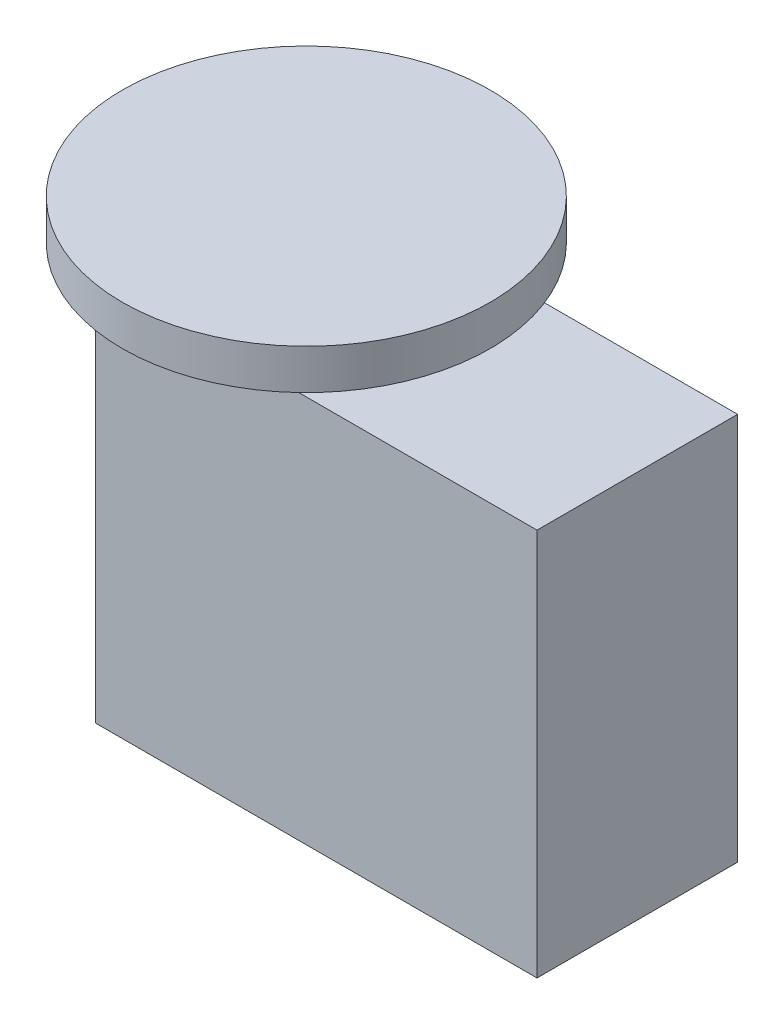
ISO-10303-21;
HEADER;
FILE_DESCRIPTION(('STEP AP214'),'2;1');
FILE_NAME('part.step','',(''),(''),'','','');
FILE_SCHEMA(('AUTOMOTIVE_DESIGN { 1 0 10303 214 1 1 1 1 }'));
ENDSEC;
DATA;
#1=APPLICATION_CONTEXT('core data for automotive mechanical design processes');
#2=APPLICATION_PROTOCOL_DEFINITION('international standard','automotive_design',2000,#1);
#3=PRODUCT_CONTEXT('',#1,'mechanical');
#4=PRODUCT('Part','Part','',(#3));
#5=PRODUCT_RELATED_PRODUCT_CATEGORY('part','',(#4));
#6=PRODUCT_DEFINITION_FORMATION('','',#4);
#7=PRODUCT_DEFINITION_CONTEXT('part definition',#1,'design');
#8=PRODUCT_DEFINITION('design','',#6,#7);
#9=PRODUCT_DEFINITION_SHAPE('','',#8);
#10=(LENGTH_UNIT() NAMED_UNIT(*) SI_UNIT(.MILLI.,.METRE.));
#11=(NAMED_UNIT(*) PLANE_ANGLE_UNIT() SI_UNIT($,.RADIAN.));
#12=(NAMED_UNIT(*) SI_UNIT($,.STERADIAN.) SOLID_ANGLE_UNIT());
#13=UNCERTAINTY_MEASURE_WITH_UNIT(LENGTH_MEASURE(1.E-05),#10,'distance_accuracy_value','');
#14=(GEOMETRIC_REPRESENTATION_CONTEXT(3) GLOBAL_UNCERTAINTY_ASSIGNED_CONTEXT((#13)) GLOBAL_UNIT_ASSIGNED_CONTEXT((#10,
#11,#12)) REPRESENTATION_CONTEXT('',''));
#15=CARTESIAN_POINT('',(0.,0.,0.));
#16=DIRECTION('',(0.,0.,1.));
#17=DIRECTION('',(1.,0.,0.));
#18=AXIS2_PLACEMENT_3D('',#15,#16,#17);
#19=CARTESIAN_POINT('',(0.,-3.,0.));
#20=DIRECTION('',(0.,1.,0.));
#21=DIRECTION('',(0.,0.,1.));
#22=AXIS2_PLACEMENT_3D('',#19,#20,#21);
#23=PLANE('',#22);
#24=CARTESIAN_POINT('',(-66.5681235261815,-3.,29.8609458280841));
#25=DIRECTION('',(0.,1.,0.));
#26=DIRECTION('',(0.,0.,1.));
#27=AXIS2_PLACEMENT_3D('',#24,#25,#26);
#28=CIRCLE('',#27,0.999999999999998);
#29=CARTESIAN_POINT('',(-66.5681235261815,-3.,30.8609458280841));
#30=VERTEX_POINT('',#29);
#31=EDGE_CURVE('E40',#30,#30,#28,.F.);
#32=ORIENTED_EDGE('',*,*,#31,.F.);
#33=EDGE_LOOP('',(#32));
#34=FACE_BOUND('',#33,.T.);
#35=DIRECTION('',(0.,0.,-1.));
#36=VECTOR('',#35,1.);
#37=CARTESIAN_POINT('',(-69.5681235261815,-3.,24.8609458280841));
#38=LINE('',#37,#36);
#39=CARTESIAN_POINT('',(-69.5681235261815,-3.,44.8609458280841));
#40=VERTEX_POINT('',#39);
#41=CARTESIAN_POINT('',(-69.5681235261815,-3.,24.8609458280841));
#42=VERTEX_POINT('',#41);
#43=EDGE_CURVE('E105',#40,#42,#38,.T.);
#44=ORIENTED_EDGE('',*,*,#43,.T.);
#45=DIRECTION('',(1.,0.,0.));
#46=VECTOR('',#45,1.);
#47=CARTESIAN_POINT('',(-69.5681235261815,-3.,24.8609458280841));
#48=LINE('',#47,#46);
#49=CARTESIAN_POINT('',(-63.5681235261815,-3.,24.8609458280841));
#50=VERTEX_POINT('',#49);
#51=EDGE_CURVE('E94',#42,#50,#48,.T.);
#52=ORIENTED_EDGE('',*,*,#51,.T.);
#53=DIRECTION('',(0.,0.,1.));
#54=VECTOR('',#53,1.);
#55=CARTESIAN_POINT('',(-63.5681235261815,-3.,24.8609458280841));
#56=LINE('',#55,#54);
#57=CARTESIAN_POINT('',(-63.5681235261815,-3.,44.8609458280841));
#58=VERTEX_POINT('',#57);
#59=EDGE_CURVE('E104',#50,#58,#56,.T.);
#60=ORIENTED_EDGE('',*,*,#59,.T.);
#61=DIRECTION('',(-1.,0.,0.));
#62=VECTOR('',#61,1.);
#63=CARTESIAN_POINT('',(-69.5681235261815,-3.,44.8609458280841));
#64=LINE('',#63,#62);
#65=EDGE_CURVE('E110',#58,#40,#64,.T.);
#66=ORIENTED_EDGE('',*,*,#65,.T.);
#67=EDGE_LOOP('',(#44,#52,#60,#66));
#68=FACE_BOUND('',#67,.T.);
#69=CARTESIAN_POINT('',(-66.5681235261815,-3.,39.8609458280841));
#70=DIRECTION('',(0.,1.,0.));
#71=DIRECTION('',(0.,0.,1.));
#72=AXIS2_PLACEMENT_3D('',#69,#70,#71);
#73=CIRCLE('',#72,0.999999999999998);
#74=CARTESIAN_POINT('',(-66.5681235261815,-3.,40.8609458280841));
#75=VERTEX_POINT('',#74);
#76=EDGE_CURVE('E11',#75,#75,#73,.F.);
#77=ORIENTED_EDGE('',*,*,#76,.F.);
#78=EDGE_LOOP('',(#77));
#79=FACE_BOUND('',#78,.T.);
#80=ADVANCED_FACE('F32',(#34,#68,#79),#23,.F.);
#81=CARTESIAN_POINT('',(0.,0.,0.));
#82=DIRECTION('',(0.,1.,0.));
#83=DIRECTION('',(0.,0.,1.));
#84=AXIS2_PLACEMENT_3D('',#81,#82,#83);
#85=PLANE('',#84);
#86=DIRECTION('',(0.,0.,1.));
#87=VECTOR('',#86,1.);
#88=CARTESIAN_POINT('',(-79.5681235261815,0.,19.8609458280841));
#89=LINE('',#88,#87);
#90=CARTESIAN_POINT('',(-79.5681235261815,0.,19.8609458280841));
#91=VERTEX_POINT('',#90);
#92=CARTESIAN_POINT('',(-79.5681235261815,0.,49.8609458280841));
#93=VERTEX_POINT('',#92);
#94=EDGE_CURVE('E139',#91,#93,#89,.T.);
#95=ORIENTED_EDGE('',*,*,#94,.F.);
#96=DIRECTION('',(-1.,0.,0.));
#97=VECTOR('',#96,1.);
#98=CARTESIAN_POINT('',(-79.5681235261815,0.,19.8609458280841));
#99=LINE('',#98,#97);
#100=CARTESIAN_POINT('',(-13.5681235261815,0.,19.8609458280841));
#101=VERTEX_POINT('',#100);
#102=EDGE_CURVE('E146',#101,#91,#99,.T.);
#103=ORIENTED_EDGE('',*,*,#102,.F.);
#104=DIRECTION('',(0.,0.,-1.));
#105=VECTOR('',#104,1.);
#106=CARTESIAN_POINT('',(-13.5681235261815,0.,19.8609458280841));
#107=LINE('',#106,#105);
#108=CARTESIAN_POINT('',(-13.5681235261815,0.,49.8609458280841));
#109=VERTEX_POINT('',#108);
#110=EDGE_CURVE('E157',#109,#101,#107,.T.);
#111=ORIENTED_EDGE('',*,*,#110,.F.);
#112=DIRECTION('',(1.,0.,0.));
#113=VECTOR('',#112,1.);
#114=CARTESIAN_POINT('',(-79.5681235261815,0.,49.8609458280841));
#115=LINE('',#114,#113);
#116=EDGE_CURVE('E155',#93,#109,#115,.T.);
#117=ORIENTED_EDGE('',*,*,#116,.F.);
#118=EDGE_LOOP('',(#95,#103,#111,#117));
#119=FACE_BOUND('',#118,.T.);
#120=DIRECTION('',(0.,0.,-1.));
#121=VECTOR('',#120,1.);
#122=CARTESIAN_POINT('',(-69.5681235261815,0.,24.8609458280841));
#123=LINE('',#122,#121);
#124=CARTESIAN_POINT('',(-69.5681235261815,0.,44.8609458280841));
#125=VERTEX_POINT('',#124);
#126=CARTESIAN_POINT('',(-69.5681235261815,0.,24.8609458280841));
#127=VERTEX_POINT('',#126);
#128=EDGE_CURVE('E117',#125,#127,#123,.T.);
#129=ORIENTED_EDGE('',*,*,#128,.F.);
#130=DIRECTION('',(-1.,0.,0.));
#131=VECTOR('',#130,1.);
#132=CARTESIAN_POINT('',(-69.5681235261815,0.,44.8609458280841));
#133=LINE('',#132,#131);
#134=CARTESIAN_POINT('',(-63.5681235261815,0.,44.8609458280841));
#135=VERTEX_POINT('',#134);
#136=EDGE_CURVE('E114',#135,#125,#133,.T.);
#137=ORIENTED_EDGE('',*,*,#136,.F.);
#138=DIRECTION('',(0.,0.,1.));
#139=VECTOR('',#138,1.);
#140=CARTESIAN_POINT('',(-63.5681235261815,0.,24.8609458280841));
#141=LINE('',#140,#139);
#142=CARTESIAN_POINT('',(-63.5681235261815,0.,24.8609458280841));
#143=VERTEX_POINT('',#142);
#144=EDGE_CURVE('E52',#143,#135,#141,.T.);
#145=ORIENTED_EDGE('',*,*,#144,.F.);
#146=DIRECTION('',(1.,0.,0.));
#147=VECTOR('',#146,1.);
#148=CARTESIAN_POINT('',(-69.5681235261815,0.,24.8609458280841));
#149=LINE('',#148,#147);
#150=EDGE_CURVE('E47',#127,#143,#149,.T.);
#151=ORIENTED_EDGE('',*,*,#150,.F.);
#152=EDGE_LOOP('',(#129,#137,#145,#151));
#153=FACE_BOUND('',#152,.T.);
#154=ADVANCED_FACE('F182',(#119,#153),#85,.F.);
#155=CARTESIAN_POINT('',(-63.0681235261815,68.,34.8609458280841));
#156=DIRECTION('',(0.,-1.,0.));
#157=DIRECTION('',(0.,0.,-1.));
#158=AXIS2_PLACEMENT_3D('',#155,#156,#157);
#159=CYLINDRICAL_SURFACE('',#158,2.5);
#160=CARTESIAN_POINT('',(-63.0681235261815,58.,34.8609458280841));
#161=DIRECTION('',(0.,1.,0.));
#162=DIRECTION('',(0.,0.,1.));
#163=AXIS2_PLACEMENT_3D('',#160,#161,#162);
#164=CIRCLE('',#163,2.5);
#165=CARTESIAN_POINT('',(-63.0681235261815,58.,37.3609458280841));
#166=VERTEX_POINT('',#165);
#167=EDGE_CURVE('E129',#166,#166,#164,.T.);
#168=ORIENTED_EDGE('',*,*,#167,.T.);
#169=EDGE_LOOP('',(#168));
#170=FACE_BOUND('',#169,.T.);
#171=CARTESIAN_POINT('',(-63.0681235261815,63.,34.8609458280841));
#172=DIRECTION('',(0.,1.,0.));
#173=DIRECTION('',(0.,0.,1.));
#174=AXIS2_PLACEMENT_3D('',#171,#172,#173);
#175=CIRCLE('',#174,2.5);
#176=CARTESIAN_POINT('',(-63.0681235261815,63.,37.3609458280841));
#177=VERTEX_POINT('',#176);
#178=EDGE_CURVE('E174',#177,#177,#175,.T.);
#179=ORIENTED_EDGE('',*,*,#178,.F.);
#180=EDGE_LOOP('',(#179));
#181=FACE_BOUND('',#180,.T.);
#182=ADVANCED_FACE('F187',(#170,#181),#159,.T.);
#183=CARTESIAN_POINT('',(0.,58.,0.));
#184=DIRECTION('',(0.,1.,0.));
#185=DIRECTION('',(0.,0.,1.));
#186=AXIS2_PLACEMENT_3D('',#183,#184,#185);
#187=PLANE('',#186);
#188=CARTESIAN_POINT('',(-63.0681235261815,58.,34.8609458280841));
#189=DIRECTION('',(0.,1.,0.));
#190=DIRECTION('',(0.,0.,1.));
#191=AXIS2_PLACEMENT_3D('',#188,#189,#190);
#192=CIRCLE('',#191,7.5);
#193=CARTESIAN_POINT('',(-63.0681235261815,58.,42.3609458280841));
#194=VERTEX_POINT('',#193);
#195=EDGE_CURVE('E171',#194,#194,#192,.F.);
#196=ORIENTED_EDGE('',*,*,#195,.F.);
#197=EDGE_LOOP('',(#196));
#198=FACE_BOUND('',#197,.T.);
#199=ORIENTED_EDGE('',*,*,#167,.F.);
#200=EDGE_LOOP('',(#199));
#201=FACE_BOUND('',#200,.T.);
#202=ADVANCED_FACE('F220',(#198,#201),#187,.T.);
#203=DIRECTION('',(0.,0.,1.));
#204=VECTOR('',#203,1.);
#205=CARTESIAN_POINT('',(-79.5681235261815,58.,19.8609458280841));
#206=LINE('',#205,#204);
#207=CARTESIAN_POINT('',(-79.5681235261815,58.,19.8609458280841));
#208=VERTEX_POINT('',#207);
#209=CARTESIAN_POINT('',(-79.5681235261815,58.,49.8609458280841));
#210=VERTEX_POINT('',#209);
#211=EDGE_CURVE('E142',#208,#210,#206,.T.);
#212=ORIENTED_EDGE('',*,*,#211,.T.);
#213=DIRECTION('',(1.,0.,0.));
#214=VECTOR('',#213,1.);
#215=CARTESIAN_POINT('',(-79.5681235261815,58.,49.8609458280841));
#216=LINE('',#215,#214);
#217=CARTESIAN_POINT('',(-13.5681235261815,58.,49.8609458280841));
#218=VERTEX_POINT('',#217);
#219=EDGE_CURVE('E145',#210,#218,#216,.T.);
#220=ORIENTED_EDGE('',*,*,#219,.T.);
#221=DIRECTION('',(0.,0.,-1.));
#222=VECTOR('',#221,1.);
#223=CARTESIAN_POINT('',(-13.5681235261815,58.,19.8609458280841));
#224=LINE('',#223,#222);
#225=CARTESIAN_POINT('',(-13.5681235261815,58.,19.8609458280841));
#226=VERTEX_POINT('',#225);
#227=EDGE_CURVE('E148',#218,#226,#224,.T.);
#228=ORIENTED_EDGE('',*,*,#227,.T.);
#229=DIRECTION('',(-1.,0.,0.));
#230=VECTOR('',#229,1.);
#231=CARTESIAN_POINT('',(-79.5681235261815,58.,19.8609458280841));
#232=LINE('',#231,#230);
#233=EDGE_CURVE('E150',#226,#208,#232,.T.);
#234=ORIENTED_EDGE('',*,*,#233,.T.);
#235=EDGE_LOOP('',(#212,#220,#228,#234));
#236=FACE_BOUND('',#235,.T.);
#237=CARTESIAN_POINT('',(-63.0681235261815,58.,34.8609458280841));
#238=DIRECTION('',(0.,1.,0.));
#239=DIRECTION('',(0.,0.,1.));
#240=AXIS2_PLACEMENT_3D('',#237,#238,#239);
#241=CIRCLE('',#240,9.);
#242=CARTESIAN_POINT('',(-63.0681235261815,58.,43.8609458280841));
#243=VERTEX_POINT('',#242);
#244=EDGE_CURVE('E135',#243,#243,#241,.T.);
#245=ORIENTED_EDGE('',*,*,#244,.F.);
#246=EDGE_LOOP('',(#245));
#247=FACE_BOUND('',#246,.T.);
#248=ADVANCED_FACE('F235',(#236,#247),#187,.T.);
#249=CARTESIAN_POINT('',(-79.5681235261815,58.,19.8609458280841));
#250=DIRECTION('',(1.,0.,0.));
#251=DIRECTION('',(0.,0.,-1.));
#252=AXIS2_PLACEMENT_3D('',#249,#250,#251);
#253=PLANE('',#252);
#254=ORIENTED_EDGE('',*,*,#94,.T.);
#255=DIRECTION('',(0.,-1.,0.));
#256=VECTOR('',#255,1.);
#257=CARTESIAN_POINT('',(-79.5681235261815,58.,49.8609458280841));
#258=LINE('',#257,#256);
#259=EDGE_CURVE('E168',#210,#93,#258,.T.);
#260=ORIENTED_EDGE('',*,*,#259,.F.);
#261=ORIENTED_EDGE('',*,*,#211,.F.);
#262=DIRECTION('',(0.,-1.,0.));
#263=VECTOR('',#262,1.);
#264=CARTESIAN_POINT('',(-79.5681235261815,58.,19.8609458280841));
#265=LINE('',#264,#263);
#266=EDGE_CURVE('E152',#208,#91,#265,.T.);
#267=ORIENTED_EDGE('',*,*,#266,.T.);
#268=EDGE_LOOP('',(#254,#260,#261,#267));
#269=FACE_BOUND('',#268,.T.);
#270=ADVANCED_FACE('F34',(#269),#253,.F.);
#271=CARTESIAN_POINT('',(-79.5681235261815,58.,49.8609458280841));
#272=DIRECTION('',(0.,0.,-1.));
#273=DIRECTION('',(-1.,0.,0.));
#274=AXIS2_PLACEMENT_3D('',#271,#272,#273);
#275=PLANE('',#274);
#276=ORIENTED_EDGE('',*,*,#116,.T.);
#277=DIRECTION('',(0.,-1.,0.));
#278=VECTOR('',#277,1.);
#279=CARTESIAN_POINT('',(-13.5681235261815,58.,49.8609458280841));
#280=LINE('',#279,#278);
#281=EDGE_CURVE('E165',#218,#109,#280,.T.);
#282=ORIENTED_EDGE('',*,*,#281,.F.);
#283=ORIENTED_EDGE('',*,*,#219,.F.);
#284=ORIENTED_EDGE('',*,*,#259,.T.);
#285=EDGE_LOOP('',(#276,#282,#283,#284));
#286=FACE_BOUND('',#285,.T.);
#287=ADVANCED_FACE('F243',(#286),#275,.F.);
#288=CARTESIAN_POINT('',(-13.5681235261815,58.,19.8609458280841));
#289=DIRECTION('',(-1.,0.,0.));
#290=DIRECTION('',(0.,0.,1.));
#291=AXIS2_PLACEMENT_3D('',#288,#289,#290);
#292=PLANE('',#291);
#293=ORIENTED_EDGE('',*,*,#110,.T.);
#294=DIRECTION('',(0.,-1.,0.));
#295=VECTOR('',#294,1.);
#296=CARTESIAN_POINT('',(-13.5681235261815,58.,19.8609458280841));
#297=LINE('',#296,#295);
#298=EDGE_CURVE('E162',#226,#101,#297,.T.);
#299=ORIENTED_EDGE('',*,*,#298,.F.);
#300=ORIENTED_EDGE('',*,*,#227,.F.);
#301=ORIENTED_EDGE('',*,*,#281,.T.);
#302=EDGE_LOOP('',(#293,#299,#300,#301));
#303=FACE_BOUND('',#302,.T.);
#304=ADVANCED_FACE('F240',(#303),#292,.F.);
#305=CARTESIAN_POINT('',(-79.5681235261815,58.,19.8609458280841));
#306=DIRECTION('',(0.,0.,1.));
#307=DIRECTION('',(1.,0.,0.));
#308=AXIS2_PLACEMENT_3D('',#305,#306,#307);
#309=PLANE('',#308);
#310=ORIENTED_EDGE('',*,*,#102,.T.);
#311=ORIENTED_EDGE('',*,*,#266,.F.);
#312=ORIENTED_EDGE('',*,*,#233,.F.);
#313=ORIENTED_EDGE('',*,*,#298,.T.);
#314=EDGE_LOOP('',(#310,#311,#312,#313));
#315=FACE_BOUND('',#314,.T.);
#316=ADVANCED_FACE('F229',(#315),#309,.F.);
#317=CARTESIAN_POINT('',(-63.0681235261815,60.,34.8609458280841));
#318=DIRECTION('',(0.,1.,0.));
#319=DIRECTION('',(0.,0.,1.));
#320=AXIS2_PLACEMENT_3D('',#317,#318,#319);
#321=PLANE('',#320);
#322=CARTESIAN_POINT('',(-63.0681235261815,60.,34.8609458280841));
#323=DIRECTION('',(0.,1.,0.));
#324=DIRECTION('',(0.,0.,1.));
#325=AXIS2_PLACEMENT_3D('',#322,#323,#324);
#326=CIRCLE('',#325,9.);
#327=CARTESIAN_POINT('',(-63.0681235261815,60.,43.8609458280841));
#328=VERTEX_POINT('',#327);
#329=EDGE_CURVE('E136',#328,#328,#326,.T.);
#330=ORIENTED_EDGE('',*,*,#329,.T.);
#331=EDGE_LOOP('',(#330));
#332=FACE_BOUND('',#331,.T.);
#333=CARTESIAN_POINT('',(-63.0681235261815,60.,34.8609458280841));
#334=DIRECTION('',(0.,1.,0.));
#335=DIRECTION('',(0.,0.,1.));
#336=AXIS2_PLACEMENT_3D('',#333,#334,#335);
#337=CIRCLE('',#336,7.5);
#338=CARTESIAN_POINT('',(-63.0681235261815,60.,42.3609458280841));
#339=VERTEX_POINT('',#338);
#340=EDGE_CURVE('E132',#339,#339,#337,.T.);
#341=ORIENTED_EDGE('',*,*,#340,.F.);
#342=EDGE_LOOP('',(#341));
#343=FACE_BOUND('',#342,.T.);
#344=ADVANCED_FACE('F226',(#332,#343),#321,.T.);
#345=CARTESIAN_POINT('',(-63.0681235261815,60.,34.8609458280841));
#346=DIRECTION('',(0.,-1.,0.));
#347=DIRECTION('',(0.,0.,-1.));
#348=AXIS2_PLACEMENT_3D('',#345,#346,#347);
#349=CYLINDRICAL_SURFACE('',#348,9.);
#350=ORIENTED_EDGE('',*,*,#329,.F.);
#351=EDGE_LOOP('',(#350));
#352=FACE_BOUND('',#351,.T.);
#353=ORIENTED_EDGE('',*,*,#244,.T.);
#354=EDGE_LOOP('',(#353));
#355=FACE_BOUND('',#354,.T.);
#356=ADVANCED_FACE('F224',(#352,#355),#349,.T.);
#357=CARTESIAN_POINT('',(-63.0681235261815,60.,34.8609458280841));
#358=DIRECTION('',(0.,-1.,0.));
#359=DIRECTION('',(0.,0.,-1.));
#360=AXIS2_PLACEMENT_3D('',#357,#358,#359);
#361=CYLINDRICAL_SURFACE('',#360,7.5);
#362=ORIENTED_EDGE('',*,*,#340,.T.);
#363=EDGE_LOOP('',(#362));
#364=FACE_BOUND('',#363,.T.);
#365=ORIENTED_EDGE('',*,*,#195,.T.);
#366=EDGE_LOOP('',(#365));
#367=FACE_BOUND('',#366,.T.);
#368=ADVANCED_FACE('F213',(#364,#367),#361,.F.);
#369=CARTESIAN_POINT('',(-63.0681235261815,63.,34.8609458280841));
#370=DIRECTION('',(0.,1.,0.));
#371=DIRECTION('',(0.,0.,1.));
#372=AXIS2_PLACEMENT_3D('',#369,#370,#371);
#373=PLANE('',#372);
#374=CARTESIAN_POINT('',(-63.0681235261815,63.,34.8609458280841));
#375=DIRECTION('',(0.,1.,0.));
#376=DIRECTION('',(0.,0.,1.));
#377=AXIS2_PLACEMENT_3D('',#374,#375,#376);
#378=CIRCLE('',#377,27.5);
#379=CARTESIAN_POINT('',(-63.0681235261815,63.,62.3609458280841));
#380=VERTEX_POINT('',#379);
#381=EDGE_CURVE('E121',#380,#380,#378,.T.);
#382=ORIENTED_EDGE('',*,*,#381,.F.);
#383=EDGE_LOOP('',(#382));
#384=FACE_BOUND('',#383,.T.);
#385=ORIENTED_EDGE('',*,*,#178,.T.);
#386=EDGE_LOOP('',(#385));
#387=FACE_BOUND('',#386,.T.);
#388=ADVANCED_FACE('F210',(#384,#387),#373,.F.);
#389=CARTESIAN_POINT('',(-63.0681235261815,63.,34.8609458280841));
#390=DIRECTION('',(0.,1.,0.));
#391=DIRECTION('',(0.,0.,1.));
#392=AXIS2_PLACEMENT_3D('',#389,#390,#391);
#393=CYLINDRICAL_SURFACE('',#392,27.5);
#394=ORIENTED_EDGE('',*,*,#381,.T.);
#395=EDGE_LOOP('',(#394));
#396=FACE_BOUND('',#395,.T.);
#397=CARTESIAN_POINT('',(-63.0681235261815,69.,34.8609458280841));
#398=DIRECTION('',(0.,1.,0.));
#399=DIRECTION('',(0.,0.,1.));
#400=AXIS2_PLACEMENT_3D('',#397,#398,#399);
#401=CIRCLE('',#400,27.5);
#402=CARTESIAN_POINT('',(-63.0681235261815,69.,62.3609458280841));
#403=VERTEX_POINT('',#402);
#404=EDGE_CURVE('E118',#403,#403,#401,.T.);
#405=ORIENTED_EDGE('',*,*,#404,.F.);
#406=EDGE_LOOP('',(#405));
#407=FACE_BOUND('',#406,.T.);
#408=ADVANCED_FACE('F208',(#396,#407),#393,.T.);
#409=CARTESIAN_POINT('',(-63.0681235261815,69.,34.8609458280841));
#410=DIRECTION('',(0.,1.,0.));
#411=DIRECTION('',(0.,0.,1.));
#412=AXIS2_PLACEMENT_3D('',#409,#410,#411);
#413=PLANE('',#412);
#414=ORIENTED_EDGE('',*,*,#404,.T.);
#415=EDGE_LOOP('',(#414));
#416=FACE_BOUND('',#415,.T.);
#417=ADVANCED_FACE('F205',(#416),#413,.T.);
#418=CARTESIAN_POINT('',(-69.5681235261815,-3.,24.8609458280841));
#419=DIRECTION('',(1.,0.,0.));
#420=DIRECTION('',(0.,0.,-1.));
#421=AXIS2_PLACEMENT_3D('',#418,#419,#420);
#422=PLANE('',#421);
#423=ORIENTED_EDGE('',*,*,#128,.T.);
#424=DIRECTION('',(0.,1.,0.));
#425=VECTOR('',#424,1.);
#426=CARTESIAN_POINT('',(-69.5681235261815,-3.,24.8609458280841));
#427=LINE('',#426,#425);
#428=EDGE_CURVE('E98',#42,#127,#427,.T.);
#429=ORIENTED_EDGE('',*,*,#428,.F.);
#430=ORIENTED_EDGE('',*,*,#43,.F.);
#431=DIRECTION('',(0.,1.,0.));
#432=VECTOR('',#431,1.);
#433=CARTESIAN_POINT('',(-69.5681235261815,-3.,44.8609458280841));
#434=LINE('',#433,#432);
#435=EDGE_CURVE('E423',#40,#125,#434,.T.);
#436=ORIENTED_EDGE('',*,*,#435,.T.);
#437=EDGE_LOOP('',(#423,#429,#430,#436));
#438=FACE_BOUND('',#437,.T.);
#439=ADVANCED_FACE('F116',(#438),#422,.F.);
#440=CARTESIAN_POINT('',(-69.5681235261815,-3.,24.8609458280841));
#441=DIRECTION('',(0.,0.,1.));
#442=DIRECTION('',(1.,0.,0.));
#443=AXIS2_PLACEMENT_3D('',#440,#441,#442);
#444=PLANE('',#443);
#445=ORIENTED_EDGE('',*,*,#150,.T.);
#446=DIRECTION('',(0.,1.,0.));
#447=VECTOR('',#446,1.);
#448=CARTESIAN_POINT('',(-63.5681235261815,-3.,24.8609458280841));
#449=LINE('',#448,#447);
#450=EDGE_CURVE('E101',#50,#143,#449,.T.);
#451=ORIENTED_EDGE('',*,*,#450,.F.);
#452=ORIENTED_EDGE('',*,*,#51,.F.);
#453=ORIENTED_EDGE('',*,*,#428,.T.);
#454=EDGE_LOOP('',(#445,#451,#452,#453));
#455=FACE_BOUND('',#454,.T.);
#456=ADVANCED_FACE('F96',(#455),#444,.F.);
#457=CARTESIAN_POINT('',(-63.5681235261815,-3.,24.8609458280841));
#458=DIRECTION('',(-1.,0.,0.));
#459=DIRECTION('',(0.,0.,1.));
#460=AXIS2_PLACEMENT_3D('',#457,#458,#459);
#461=PLANE('',#460);
#462=ORIENTED_EDGE('',*,*,#144,.T.);
#463=DIRECTION('',(0.,1.,0.));
#464=VECTOR('',#463,1.);
#465=CARTESIAN_POINT('',(-63.5681235261815,-3.,44.8609458280841));
#466=LINE('',#465,#464);
#467=EDGE_CURVE('E123',#58,#135,#466,.T.);
#468=ORIENTED_EDGE('',*,*,#467,.F.);
#469=ORIENTED_EDGE('',*,*,#59,.F.);
#470=ORIENTED_EDGE('',*,*,#450,.T.);
#471=EDGE_LOOP('',(#462,#468,#469,#470));
#472=FACE_BOUND('',#471,.T.);
#473=ADVANCED_FACE('F196',(#472),#461,.F.);
#474=CARTESIAN_POINT('',(-69.5681235261815,-3.,44.8609458280841));
#475=DIRECTION('',(0.,0.,-1.));
#476=DIRECTION('',(-1.,0.,0.));
#477=AXIS2_PLACEMENT_3D('',#474,#475,#476);
#478=PLANE('',#477);
#479=ORIENTED_EDGE('',*,*,#136,.T.);
#480=ORIENTED_EDGE('',*,*,#435,.F.);
#481=ORIENTED_EDGE('',*,*,#65,.F.);
#482=ORIENTED_EDGE('',*,*,#467,.T.);
#483=EDGE_LOOP('',(#479,#480,#481,#482));
#484=FACE_BOUND('',#483,.T.);
#485=ADVANCED_FACE('F193',(#484),#478,.F.);
#486=CARTESIAN_POINT('',(-66.5681235261815,-6.,29.8609458280841));
#487=DIRECTION('',(0.,1.,0.));
#488=DIRECTION('',(0.,0.,1.));
#489=AXIS2_PLACEMENT_3D('',#486,#487,#488);
#490=CYLINDRICAL_SURFACE('',#489,0.999999999999998);
#491=CARTESIAN_POINT('',(-66.5681235261815,-6.,29.8609458280841));
#492=DIRECTION('',(0.,-1.,0.));
#493=DIRECTION('',(0.,0.,-1.));
#494=AXIS2_PLACEMENT_3D('',#491,#492,#493);
#495=CIRCLE('',#494,0.999999999999998);
#496=CARTESIAN_POINT('',(-66.5681235261815,-6.,28.8609458280841));
#497=VERTEX_POINT('',#496);
#498=EDGE_CURVE('E416',#497,#497,#495,.T.);
#499=ORIENTED_EDGE('',*,*,#498,.F.);
#500=EDGE_LOOP('',(#499));
#501=FACE_BOUND('',#500,.T.);
#502=ORIENTED_EDGE('',*,*,#31,.T.);
#503=EDGE_LOOP('',(#502));
#504=FACE_BOUND('',#503,.T.);
#505=ADVANCED_FACE('F179',(#501,#504),#490,.T.);
#506=CARTESIAN_POINT('',(-66.5681235261815,-6.,29.8609458280841));
#507=DIRECTION('',(0.,-1.,0.));
#508=DIRECTION('',(0.,0.,-1.));
#509=AXIS2_PLACEMENT_3D('',#506,#507,#508);
#510=PLANE('',#509);
#511=ORIENTED_EDGE('',*,*,#498,.T.);
#512=EDGE_LOOP('',(#511));
#513=FACE_BOUND('',#512,.T.);
#514=ADVANCED_FACE('F340',(#513),#510,.T.);
#515=CARTESIAN_POINT('',(-66.5681235261815,-6.,39.8609458280841));
#516=DIRECTION('',(0.,1.,0.));
#517=DIRECTION('',(0.,0.,1.));
#518=AXIS2_PLACEMENT_3D('',#515,#516,#517);
#519=CYLINDRICAL_SURFACE('',#518,0.999999999999998);
#520=CARTESIAN_POINT('',(-66.5681235261815,-6.,39.8609458280841));
#521=DIRECTION('',(0.,-1.,0.));
#522=DIRECTION('',(0.,0.,-1.));
#523=AXIS2_PLACEMENT_3D('',#520,#521,#522);
#524=CIRCLE('',#523,0.999999999999998);
#525=CARTESIAN_POINT('',(-66.5681235261815,-6.,38.8609458280841));
#526=VERTEX_POINT('',#525);
#527=EDGE_CURVE('E415',#526,#526,#524,.T.);
#528=ORIENTED_EDGE('',*,*,#527,.F.);
#529=EDGE_LOOP('',(#528));
#530=FACE_BOUND('',#529,.T.);
#531=ORIENTED_EDGE('',*,*,#76,.T.);
#532=EDGE_LOOP('',(#531));
#533=FACE_BOUND('',#532,.T.);
#534=ADVANCED_FACE('F347',(#530,#533),#519,.T.);
#535=CARTESIAN_POINT('',(-66.5681235261815,-6.,39.8609458280841));
#536=DIRECTION('',(0.,-1.,0.));
#537=DIRECTION('',(0.,0.,-1.));
#538=AXIS2_PLACEMENT_3D('',#535,#536,#537);
#539=PLANE('',#538);
#540=ORIENTED_EDGE('',*,*,#527,.T.);
#541=EDGE_LOOP('',(#540));
#542=FACE_BOUND('',#541,.T.);
#543=ADVANCED_FACE('F354',(#542),#539,.T.);
#544=CLOSED_SHELL('',(#80,#154,#182,#202,#248,#270,#287,#304,#316,#344,#356,#368,#388,#408,#417,
#439,#456,#473,#485,#505,#514,#534,#543));
#545=MANIFOLD_SOLID_BREP('B2',#544);
#546=ADVANCED_BREP_SHAPE_REPRESENTATION('',(#18,#545),#14);
#547=SHAPE_DEFINITION_REPRESENTATION(#9,#546);
ENDSEC;
END-ISO-10303-21;
